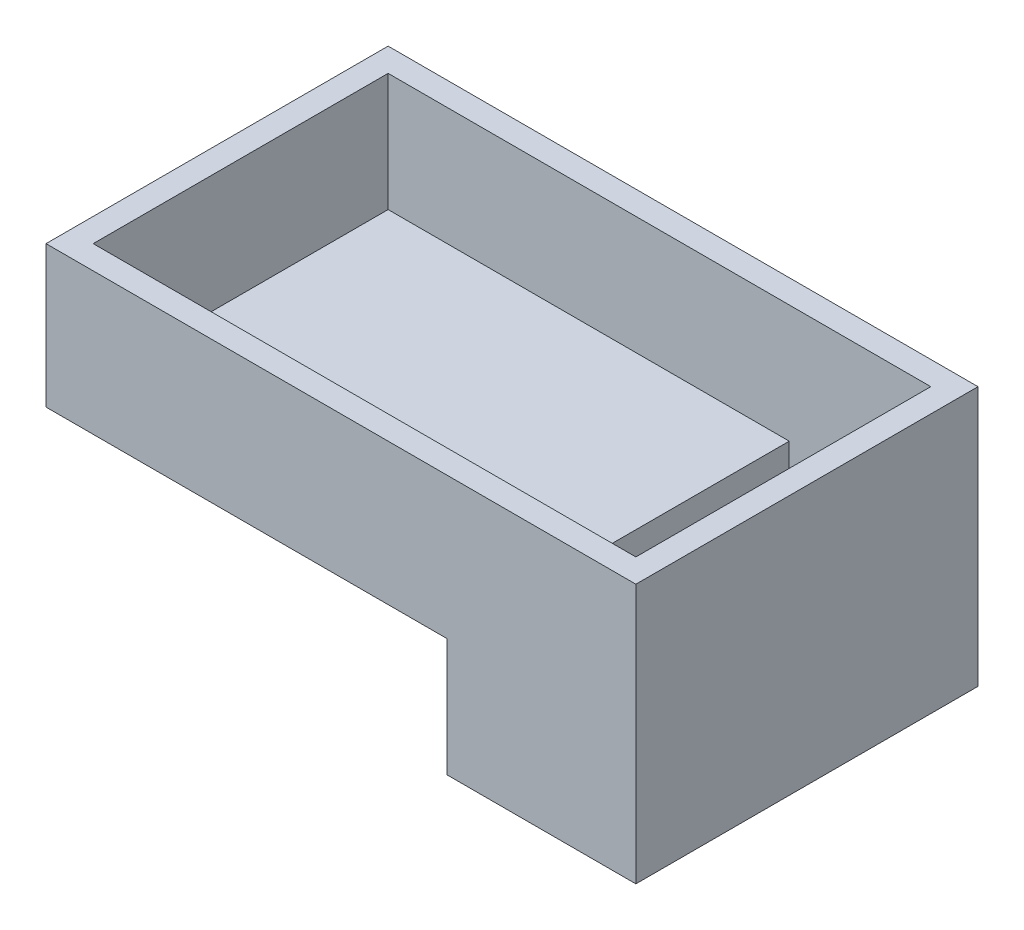
ISO-10303-21;
HEADER;
FILE_DESCRIPTION(('STEP AP214'),'2;1');
FILE_NAME('part.step','',(''),(''),'','','');
FILE_SCHEMA(('AUTOMOTIVE_DESIGN { 1 0 10303 214 1 1 1 1 }'));
ENDSEC;
DATA;
#1=APPLICATION_CONTEXT('core data for automotive mechanical design processes');
#2=APPLICATION_PROTOCOL_DEFINITION('international standard','automotive_design',2000,#1);
#3=PRODUCT_CONTEXT('',#1,'mechanical');
#4=PRODUCT('Part','Part','',(#3));
#5=PRODUCT_RELATED_PRODUCT_CATEGORY('part','',(#4));
#6=PRODUCT_DEFINITION_FORMATION('','',#4);
#7=PRODUCT_DEFINITION_CONTEXT('part definition',#1,'design');
#8=PRODUCT_DEFINITION('design','',#6,#7);
#9=PRODUCT_DEFINITION_SHAPE('','',#8);
#10=(LENGTH_UNIT() NAMED_UNIT(*) SI_UNIT(.MILLI.,.METRE.));
#11=(NAMED_UNIT(*) PLANE_ANGLE_UNIT() SI_UNIT($,.RADIAN.));
#12=(NAMED_UNIT(*) SI_UNIT($,.STERADIAN.) SOLID_ANGLE_UNIT());
#13=UNCERTAINTY_MEASURE_WITH_UNIT(LENGTH_MEASURE(1.E-05),#10,'distance_accuracy_value','');
#14=(GEOMETRIC_REPRESENTATION_CONTEXT(3) GLOBAL_UNCERTAINTY_ASSIGNED_CONTEXT((#13)) GLOBAL_UNIT_ASSIGNED_CONTEXT((#10,
#11,#12)) REPRESENTATION_CONTEXT('',''));
#15=CARTESIAN_POINT('',(0.,0.,0.));
#16=DIRECTION('',(0.,0.,1.));
#17=DIRECTION('',(1.,0.,0.));
#18=AXIS2_PLACEMENT_3D('',#15,#16,#17);
#19=CARTESIAN_POINT('',(0.,0.,1.));
#20=DIRECTION('',(0.,0.,1.));
#21=DIRECTION('',(1.,0.,0.));
#22=AXIS2_PLACEMENT_3D('',#19,#20,#21);
#23=PLANE('',#22);
#24=DIRECTION('',(-1.,0.,0.));
#25=VECTOR('',#24,1.);
#26=CARTESIAN_POINT('',(-28.921953221469,26.9609766107345,1.));
#27=LINE('',#26,#25);
#28=CARTESIAN_POINT('',(-29.921953221469,26.9609766107345,1.));
#29=VERTEX_POINT('',#28);
#30=CARTESIAN_POINT('',(-52.921953221469,26.9609766107345,1.));
#31=VERTEX_POINT('',#30);
#32=EDGE_CURVE('E240',#29,#31,#27,.T.);
#33=ORIENTED_EDGE('',*,*,#32,.T.);
#34=DIRECTION('',(0.,-1.,0.));
#35=VECTOR('',#34,1.);
#36=CARTESIAN_POINT('',(-52.921953221469,26.9609766107345,1.));
#37=LINE('',#36,#35);
#38=CARTESIAN_POINT('',(-52.921953221469,21.9609766107345,1.));
#39=VERTEX_POINT('',#38);
#40=EDGE_CURVE('E189',#31,#39,#37,.T.);
#41=ORIENTED_EDGE('',*,*,#40,.T.);
#42=DIRECTION('',(1.,0.,0.));
#43=VECTOR('',#42,1.);
#44=CARTESIAN_POINT('',(-52.921953221469,21.9609766107345,1.));
#45=LINE('',#44,#43);
#46=CARTESIAN_POINT('',(-35.921953221469,21.9609766107345,1.));
#47=VERTEX_POINT('',#46);
#48=EDGE_CURVE('E216',#39,#47,#45,.T.);
#49=ORIENTED_EDGE('',*,*,#48,.T.);
#50=DIRECTION('',(0.,-1.,0.));
#51=VECTOR('',#50,1.);
#52=CARTESIAN_POINT('',(-35.921953221469,21.9609766107345,1.));
#53=LINE('',#52,#51);
#54=CARTESIAN_POINT('',(-35.921953221469,16.9609766107345,1.));
#55=VERTEX_POINT('',#54);
#56=EDGE_CURVE('E212',#47,#55,#53,.T.);
#57=ORIENTED_EDGE('',*,*,#56,.T.);
#58=DIRECTION('',(1.,0.,0.));
#59=VECTOR('',#58,1.);
#60=CARTESIAN_POINT('',(-35.921953221469,16.9609766107345,1.));
#61=LINE('',#60,#59);
#62=CARTESIAN_POINT('',(-29.921953221469,16.9609766107345,1.));
#63=VERTEX_POINT('',#62);
#64=EDGE_CURVE('E208',#55,#63,#61,.T.);
#65=ORIENTED_EDGE('',*,*,#64,.T.);
#66=DIRECTION('',(0.,1.,0.));
#67=VECTOR('',#66,1.);
#68=CARTESIAN_POINT('',(-29.921953221469,16.9609766107345,1.));
#69=LINE('',#68,#67);
#70=EDGE_CURVE('E183',#63,#29,#69,.T.);
#71=ORIENTED_EDGE('',*,*,#70,.T.);
#72=EDGE_LOOP('',(#33,#41,#49,#57,#65,#71));
#73=FACE_BOUND('',#72,.T.);
#74=ADVANCED_FACE('F45',(#73),#23,.T.);
#75=CARTESIAN_POINT('',(-28.921953221469,15.9609766107345,1.));
#76=DIRECTION('',(-1.,0.,0.));
#77=DIRECTION('',(0.,0.,1.));
#78=AXIS2_PLACEMENT_3D('',#75,#76,#77);
#79=PLANE('',#78);
#80=DIRECTION('',(0.,1.,0.));
#81=VECTOR('',#80,1.);
#82=CARTESIAN_POINT('',(-28.921953221469,15.9609766107345,0.));
#83=LINE('',#82,#81);
#84=CARTESIAN_POINT('',(-28.921953221469,15.9609766107345,0.));
#85=VERTEX_POINT('',#84);
#86=CARTESIAN_POINT('',(-28.921953221469,26.9609766107345,0.));
#87=VERTEX_POINT('',#86);
#88=EDGE_CURVE('E239',#85,#87,#83,.T.);
#89=ORIENTED_EDGE('',*,*,#88,.T.);
#90=DIRECTION('',(0.,0.,-1.));
#91=VECTOR('',#90,1.);
#92=CARTESIAN_POINT('',(-28.921953221469,26.9609766107345,1.));
#93=LINE('',#92,#91);
#94=CARTESIAN_POINT('',(-28.921953221469,26.9609766107345,14.5));
#95=VERTEX_POINT('',#94);
#96=EDGE_CURVE('E11',#95,#87,#93,.T.);
#97=ORIENTED_EDGE('',*,*,#96,.F.);
#98=DIRECTION('',(0.,-1.,0.));
#99=VECTOR('',#98,1.);
#100=CARTESIAN_POINT('',(-28.921953221469,26.9609766107345,14.5));
#101=LINE('',#100,#99);
#102=CARTESIAN_POINT('',(-28.921953221469,15.9609766107345,14.5));
#103=VERTEX_POINT('',#102);
#104=EDGE_CURVE('E173',#95,#103,#101,.T.);
#105=ORIENTED_EDGE('',*,*,#104,.T.);
#106=DIRECTION('',(0.,0.,-1.));
#107=VECTOR('',#106,1.);
#108=CARTESIAN_POINT('',(-28.921953221469,15.9609766107345,1.));
#109=LINE('',#108,#107);
#110=EDGE_CURVE('E244',#103,#85,#109,.T.);
#111=ORIENTED_EDGE('',*,*,#110,.T.);
#112=EDGE_LOOP('',(#89,#97,#105,#111));
#113=FACE_BOUND('',#112,.T.);
#114=ADVANCED_FACE('F47',(#113),#79,.F.);
#115=CARTESIAN_POINT('',(-28.921953221469,26.9609766107345,1.));
#116=DIRECTION('',(0.,-1.,0.));
#117=DIRECTION('',(0.,0.,-1.));
#118=AXIS2_PLACEMENT_3D('',#115,#116,#117);
#119=PLANE('',#118);
#120=DIRECTION('',(0.,0.,-1.));
#121=VECTOR('',#120,1.);
#122=CARTESIAN_POINT('',(-29.921953221469,26.9609766107345,13.5));
#123=LINE('',#122,#121);
#124=CARTESIAN_POINT('',(-29.921953221469,26.9609766107345,13.5));
#125=VERTEX_POINT('',#124);
#126=EDGE_CURVE('E61',#125,#29,#123,.T.);
#127=ORIENTED_EDGE('',*,*,#126,.F.);
#128=DIRECTION('',(1.,0.,0.));
#129=VECTOR('',#128,1.);
#130=CARTESIAN_POINT('',(-53.921953221469,26.9609766107345,13.5));
#131=LINE('',#130,#129);
#132=CARTESIAN_POINT('',(-52.921953221469,26.9609766107345,13.5));
#133=VERTEX_POINT('',#132);
#134=EDGE_CURVE('E166',#133,#125,#131,.T.);
#135=ORIENTED_EDGE('',*,*,#134,.F.);
#136=DIRECTION('',(0.,0.,-1.));
#137=VECTOR('',#136,1.);
#138=CARTESIAN_POINT('',(-52.921953221469,26.9609766107345,13.5));
#139=LINE('',#138,#137);
#140=EDGE_CURVE('E205',#133,#31,#139,.T.);
#141=ORIENTED_EDGE('',*,*,#140,.T.);
#142=ORIENTED_EDGE('',*,*,#32,.F.);
#143=EDGE_LOOP('',(#127,#135,#141,#142));
#144=FACE_BOUND('',#143,.T.);
#145=DIRECTION('',(-1.,0.,0.));
#146=VECTOR('',#145,1.);
#147=CARTESIAN_POINT('',(-28.921953221469,26.9609766107345,0.));
#148=LINE('',#147,#146);
#149=CARTESIAN_POINT('',(-53.921953221469,26.9609766107345,0.));
#150=VERTEX_POINT('',#149);
#151=EDGE_CURVE('E248',#87,#150,#148,.T.);
#152=ORIENTED_EDGE('',*,*,#151,.T.);
#153=DIRECTION('',(0.,0.,-1.));
#154=VECTOR('',#153,1.);
#155=CARTESIAN_POINT('',(-53.921953221469,26.9609766107345,1.));
#156=LINE('',#155,#154);
#157=CARTESIAN_POINT('',(-53.921953221469,26.9609766107345,14.5));
#158=VERTEX_POINT('',#157);
#159=EDGE_CURVE('E54',#158,#150,#156,.T.);
#160=ORIENTED_EDGE('',*,*,#159,.F.);
#161=DIRECTION('',(1.,0.,0.));
#162=VECTOR('',#161,1.);
#163=CARTESIAN_POINT('',(-53.921953221469,26.9609766107345,14.5));
#164=LINE('',#163,#162);
#165=EDGE_CURVE('E160',#158,#95,#164,.T.);
#166=ORIENTED_EDGE('',*,*,#165,.T.);
#167=ORIENTED_EDGE('',*,*,#96,.T.);
#168=EDGE_LOOP('',(#152,#160,#166,#167));
#169=FACE_BOUND('',#168,.T.);
#170=ADVANCED_FACE('F277',(#144,#169),#119,.F.);
#171=CARTESIAN_POINT('',(-53.921953221469,26.9609766107345,1.));
#172=DIRECTION('',(1.,0.,0.));
#173=DIRECTION('',(0.,0.,-1.));
#174=AXIS2_PLACEMENT_3D('',#171,#172,#173);
#175=PLANE('',#174);
#176=DIRECTION('',(0.,-1.,0.));
#177=VECTOR('',#176,1.);
#178=CARTESIAN_POINT('',(-53.921953221469,26.9609766107345,0.));
#179=LINE('',#178,#177);
#180=CARTESIAN_POINT('',(-53.921953221469,20.9609766107345,0.));
#181=VERTEX_POINT('',#180);
#182=EDGE_CURVE('E144',#150,#181,#179,.T.);
#183=ORIENTED_EDGE('',*,*,#182,.T.);
#184=DIRECTION('',(0.,0.,-1.));
#185=VECTOR('',#184,1.);
#186=CARTESIAN_POINT('',(-53.921953221469,20.9609766107345,1.));
#187=LINE('',#186,#185);
#188=CARTESIAN_POINT('',(-53.921953221469,20.9609766107345,14.5));
#189=VERTEX_POINT('',#188);
#190=EDGE_CURVE('E138',#189,#181,#187,.T.);
#191=ORIENTED_EDGE('',*,*,#190,.F.);
#192=DIRECTION('',(0.,1.,0.));
#193=VECTOR('',#192,1.);
#194=CARTESIAN_POINT('',(-53.921953221469,20.9609766107345,14.5));
#195=LINE('',#194,#193);
#196=EDGE_CURVE('E142',#189,#158,#195,.T.);
#197=ORIENTED_EDGE('',*,*,#196,.T.);
#198=ORIENTED_EDGE('',*,*,#159,.T.);
#199=EDGE_LOOP('',(#183,#191,#197,#198));
#200=FACE_BOUND('',#199,.T.);
#201=ADVANCED_FACE('F140',(#200),#175,.F.);
#202=CARTESIAN_POINT('',(-53.921953221469,20.9609766107345,1.));
#203=DIRECTION('',(0.,1.,0.));
#204=DIRECTION('',(0.,0.,1.));
#205=AXIS2_PLACEMENT_3D('',#202,#203,#204);
#206=PLANE('',#205);
#207=DIRECTION('',(1.,0.,0.));
#208=VECTOR('',#207,1.);
#209=CARTESIAN_POINT('',(-53.921953221469,20.9609766107345,0.));
#210=LINE('',#209,#208);
#211=CARTESIAN_POINT('',(-36.921953221469,20.9609766107345,0.));
#212=VERTEX_POINT('',#211);
#213=EDGE_CURVE('E253',#181,#212,#210,.T.);
#214=ORIENTED_EDGE('',*,*,#213,.T.);
#215=DIRECTION('',(0.,0.,-1.));
#216=VECTOR('',#215,1.);
#217=CARTESIAN_POINT('',(-36.921953221469,20.9609766107345,1.));
#218=LINE('',#217,#216);
#219=CARTESIAN_POINT('',(-36.921953221469,20.9609766107345,14.5));
#220=VERTEX_POINT('',#219);
#221=EDGE_CURVE('E149',#220,#212,#218,.T.);
#222=ORIENTED_EDGE('',*,*,#221,.F.);
#223=DIRECTION('',(-1.,0.,0.));
#224=VECTOR('',#223,1.);
#225=CARTESIAN_POINT('',(-36.921953221469,20.9609766107345,14.5));
#226=LINE('',#225,#224);
#227=EDGE_CURVE('E156',#220,#189,#226,.T.);
#228=ORIENTED_EDGE('',*,*,#227,.T.);
#229=ORIENTED_EDGE('',*,*,#190,.T.);
#230=EDGE_LOOP('',(#214,#222,#228,#229));
#231=FACE_BOUND('',#230,.T.);
#232=ADVANCED_FACE('F163',(#231),#206,.F.);
#233=CARTESIAN_POINT('',(-36.921953221469,20.9609766107345,1.));
#234=DIRECTION('',(1.,0.,0.));
#235=DIRECTION('',(0.,0.,-1.));
#236=AXIS2_PLACEMENT_3D('',#233,#234,#235);
#237=PLANE('',#236);
#238=DIRECTION('',(0.,-1.,0.));
#239=VECTOR('',#238,1.);
#240=CARTESIAN_POINT('',(-36.921953221469,20.9609766107345,0.));
#241=LINE('',#240,#239);
#242=CARTESIAN_POINT('',(-36.921953221469,15.9609766107345,0.));
#243=VERTEX_POINT('',#242);
#244=EDGE_CURVE('E256',#212,#243,#241,.T.);
#245=ORIENTED_EDGE('',*,*,#244,.T.);
#246=DIRECTION('',(0.,0.,-1.));
#247=VECTOR('',#246,1.);
#248=CARTESIAN_POINT('',(-36.921953221469,15.9609766107345,1.));
#249=LINE('',#248,#247);
#250=CARTESIAN_POINT('',(-36.921953221469,15.9609766107345,14.5));
#251=VERTEX_POINT('',#250);
#252=EDGE_CURVE('E263',#251,#243,#249,.T.);
#253=ORIENTED_EDGE('',*,*,#252,.F.);
#254=DIRECTION('',(0.,1.,0.));
#255=VECTOR('',#254,1.);
#256=CARTESIAN_POINT('',(-36.921953221469,15.9609766107345,14.5));
#257=LINE('',#256,#255);
#258=EDGE_CURVE('E181',#251,#220,#257,.T.);
#259=ORIENTED_EDGE('',*,*,#258,.T.);
#260=ORIENTED_EDGE('',*,*,#221,.T.);
#261=EDGE_LOOP('',(#245,#253,#259,#260));
#262=FACE_BOUND('',#261,.T.);
#263=ADVANCED_FACE('F274',(#262),#237,.F.);
#264=CARTESIAN_POINT('',(-36.921953221469,15.9609766107345,1.));
#265=DIRECTION('',(0.,1.,0.));
#266=DIRECTION('',(0.,0.,1.));
#267=AXIS2_PLACEMENT_3D('',#264,#265,#266);
#268=PLANE('',#267);
#269=DIRECTION('',(1.,0.,0.));
#270=VECTOR('',#269,1.);
#271=CARTESIAN_POINT('',(-36.921953221469,15.9609766107345,0.));
#272=LINE('',#271,#270);
#273=EDGE_CURVE('E69',#243,#85,#272,.T.);
#274=ORIENTED_EDGE('',*,*,#273,.T.);
#275=ORIENTED_EDGE('',*,*,#110,.F.);
#276=DIRECTION('',(-1.,0.,0.));
#277=VECTOR('',#276,1.);
#278=CARTESIAN_POINT('',(-28.921953221469,15.9609766107345,14.5));
#279=LINE('',#278,#277);
#280=EDGE_CURVE('E177',#103,#251,#279,.T.);
#281=ORIENTED_EDGE('',*,*,#280,.T.);
#282=ORIENTED_EDGE('',*,*,#252,.T.);
#283=EDGE_LOOP('',(#274,#275,#281,#282));
#284=FACE_BOUND('',#283,.T.);
#285=ADVANCED_FACE('F296',(#284),#268,.F.);
#286=CARTESIAN_POINT('',(0.,0.,0.));
#287=DIRECTION('',(0.,0.,1.));
#288=DIRECTION('',(1.,0.,0.));
#289=AXIS2_PLACEMENT_3D('',#286,#287,#288);
#290=PLANE('',#289);
#291=ORIENTED_EDGE('',*,*,#88,.F.);
#292=ORIENTED_EDGE('',*,*,#273,.F.);
#293=ORIENTED_EDGE('',*,*,#244,.F.);
#294=ORIENTED_EDGE('',*,*,#213,.F.);
#295=ORIENTED_EDGE('',*,*,#182,.F.);
#296=ORIENTED_EDGE('',*,*,#151,.F.);
#297=EDGE_LOOP('',(#291,#292,#293,#294,#295,#296));
#298=FACE_BOUND('',#297,.T.);
#299=ADVANCED_FACE('F271',(#298),#290,.F.);
#300=CARTESIAN_POINT('',(-29.921953221469,16.9609766107345,13.5));
#301=DIRECTION('',(-1.,0.,0.));
#302=DIRECTION('',(0.,0.,1.));
#303=AXIS2_PLACEMENT_3D('',#300,#301,#302);
#304=PLANE('',#303);
#305=ORIENTED_EDGE('',*,*,#70,.F.);
#306=DIRECTION('',(0.,0.,-1.));
#307=VECTOR('',#306,1.);
#308=CARTESIAN_POINT('',(-29.921953221469,16.9609766107345,13.5));
#309=LINE('',#308,#307);
#310=CARTESIAN_POINT('',(-29.921953221469,16.9609766107345,13.5));
#311=VERTEX_POINT('',#310);
#312=EDGE_CURVE('E234',#311,#63,#309,.T.);
#313=ORIENTED_EDGE('',*,*,#312,.F.);
#314=DIRECTION('',(0.,1.,0.));
#315=VECTOR('',#314,1.);
#316=CARTESIAN_POINT('',(-29.921953221469,16.9609766107345,13.5));
#317=LINE('',#316,#315);
#318=EDGE_CURVE('E185',#311,#125,#317,.T.);
#319=ORIENTED_EDGE('',*,*,#318,.T.);
#320=ORIENTED_EDGE('',*,*,#126,.T.);
#321=EDGE_LOOP('',(#305,#313,#319,#320));
#322=FACE_BOUND('',#321,.T.);
#323=ADVANCED_FACE('F293',(#322),#304,.T.);
#324=CARTESIAN_POINT('',(-35.921953221469,16.9609766107345,13.5));
#325=DIRECTION('',(0.,1.,0.));
#326=DIRECTION('',(0.,0.,1.));
#327=AXIS2_PLACEMENT_3D('',#324,#325,#326);
#328=PLANE('',#327);
#329=ORIENTED_EDGE('',*,*,#64,.F.);
#330=DIRECTION('',(0.,0.,-1.));
#331=VECTOR('',#330,1.);
#332=CARTESIAN_POINT('',(-35.921953221469,16.9609766107345,13.5));
#333=LINE('',#332,#331);
#334=CARTESIAN_POINT('',(-35.921953221469,16.9609766107345,13.5));
#335=VERTEX_POINT('',#334);
#336=EDGE_CURVE('E231',#335,#55,#333,.T.);
#337=ORIENTED_EDGE('',*,*,#336,.F.);
#338=DIRECTION('',(1.,0.,0.));
#339=VECTOR('',#338,1.);
#340=CARTESIAN_POINT('',(-35.921953221469,16.9609766107345,13.5));
#341=LINE('',#340,#339);
#342=EDGE_CURVE('E188',#335,#311,#341,.T.);
#343=ORIENTED_EDGE('',*,*,#342,.T.);
#344=ORIENTED_EDGE('',*,*,#312,.T.);
#345=EDGE_LOOP('',(#329,#337,#343,#344));
#346=FACE_BOUND('',#345,.T.);
#347=ADVANCED_FACE('F324',(#346),#328,.T.);
#348=CARTESIAN_POINT('',(-35.921953221469,21.9609766107345,13.5));
#349=DIRECTION('',(1.,0.,0.));
#350=DIRECTION('',(0.,0.,-1.));
#351=AXIS2_PLACEMENT_3D('',#348,#349,#350);
#352=PLANE('',#351);
#353=ORIENTED_EDGE('',*,*,#56,.F.);
#354=DIRECTION('',(0.,0.,-1.));
#355=VECTOR('',#354,1.);
#356=CARTESIAN_POINT('',(-35.921953221469,21.9609766107345,13.5));
#357=LINE('',#356,#355);
#358=CARTESIAN_POINT('',(-35.921953221469,21.9609766107345,13.5));
#359=VERTEX_POINT('',#358);
#360=EDGE_CURVE('E228',#359,#47,#357,.T.);
#361=ORIENTED_EDGE('',*,*,#360,.F.);
#362=DIRECTION('',(0.,-1.,0.));
#363=VECTOR('',#362,1.);
#364=CARTESIAN_POINT('',(-35.921953221469,21.9609766107345,13.5));
#365=LINE('',#364,#363);
#366=EDGE_CURVE('E193',#359,#335,#365,.T.);
#367=ORIENTED_EDGE('',*,*,#366,.T.);
#368=ORIENTED_EDGE('',*,*,#336,.T.);
#369=EDGE_LOOP('',(#353,#361,#367,#368));
#370=FACE_BOUND('',#369,.T.);
#371=ADVANCED_FACE('F331',(#370),#352,.T.);
#372=CARTESIAN_POINT('',(-52.921953221469,21.9609766107345,13.5));
#373=DIRECTION('',(0.,1.,0.));
#374=DIRECTION('',(0.,0.,1.));
#375=AXIS2_PLACEMENT_3D('',#372,#373,#374);
#376=PLANE('',#375);
#377=ORIENTED_EDGE('',*,*,#48,.F.);
#378=DIRECTION('',(0.,0.,-1.));
#379=VECTOR('',#378,1.);
#380=CARTESIAN_POINT('',(-52.921953221469,21.9609766107345,13.5));
#381=LINE('',#380,#379);
#382=CARTESIAN_POINT('',(-52.921953221469,21.9609766107345,13.5));
#383=VERTEX_POINT('',#382);
#384=EDGE_CURVE('E225',#383,#39,#381,.T.);
#385=ORIENTED_EDGE('',*,*,#384,.F.);
#386=DIRECTION('',(1.,0.,0.));
#387=VECTOR('',#386,1.);
#388=CARTESIAN_POINT('',(-52.921953221469,21.9609766107345,13.5));
#389=LINE('',#388,#387);
#390=EDGE_CURVE('E197',#383,#359,#389,.T.);
#391=ORIENTED_EDGE('',*,*,#390,.T.);
#392=ORIENTED_EDGE('',*,*,#360,.T.);
#393=EDGE_LOOP('',(#377,#385,#391,#392));
#394=FACE_BOUND('',#393,.T.);
#395=ADVANCED_FACE('F339',(#394),#376,.T.);
#396=CARTESIAN_POINT('',(-52.921953221469,26.9609766107345,13.5));
#397=DIRECTION('',(1.,0.,0.));
#398=DIRECTION('',(0.,0.,-1.));
#399=AXIS2_PLACEMENT_3D('',#396,#397,#398);
#400=PLANE('',#399);
#401=ORIENTED_EDGE('',*,*,#40,.F.);
#402=ORIENTED_EDGE('',*,*,#140,.F.);
#403=DIRECTION('',(0.,-1.,0.));
#404=VECTOR('',#403,1.);
#405=CARTESIAN_POINT('',(-52.921953221469,26.9609766107345,13.5));
#406=LINE('',#405,#404);
#407=EDGE_CURVE('E201',#133,#383,#406,.T.);
#408=ORIENTED_EDGE('',*,*,#407,.T.);
#409=ORIENTED_EDGE('',*,*,#384,.T.);
#410=EDGE_LOOP('',(#401,#402,#408,#409));
#411=FACE_BOUND('',#410,.T.);
#412=ADVANCED_FACE('F348',(#411),#400,.T.);
#413=CARTESIAN_POINT('',(0.,0.,13.5));
#414=DIRECTION('',(0.,0.,-1.));
#415=DIRECTION('',(-1.,0.,0.));
#416=AXIS2_PLACEMENT_3D('',#413,#414,#415);
#417=PLANE('',#416);
#418=ORIENTED_EDGE('',*,*,#318,.F.);
#419=ORIENTED_EDGE('',*,*,#342,.F.);
#420=ORIENTED_EDGE('',*,*,#366,.F.);
#421=ORIENTED_EDGE('',*,*,#390,.F.);
#422=ORIENTED_EDGE('',*,*,#407,.F.);
#423=ORIENTED_EDGE('',*,*,#134,.T.);
#424=EDGE_LOOP('',(#418,#419,#420,#421,#422,#423));
#425=FACE_BOUND('',#424,.T.);
#426=ADVANCED_FACE('F357',(#425),#417,.T.);
#427=CARTESIAN_POINT('',(0.,0.,14.5));
#428=DIRECTION('',(0.,0.,-1.));
#429=DIRECTION('',(-1.,0.,0.));
#430=AXIS2_PLACEMENT_3D('',#427,#428,#429);
#431=PLANE('',#430);
#432=ORIENTED_EDGE('',*,*,#227,.F.);
#433=ORIENTED_EDGE('',*,*,#258,.F.);
#434=ORIENTED_EDGE('',*,*,#280,.F.);
#435=ORIENTED_EDGE('',*,*,#104,.F.);
#436=ORIENTED_EDGE('',*,*,#165,.F.);
#437=ORIENTED_EDGE('',*,*,#196,.F.);
#438=EDGE_LOOP('',(#432,#433,#434,#435,#436,#437));
#439=FACE_BOUND('',#438,.T.);
#440=ADVANCED_FACE('F154',(#439),#431,.F.);
#441=CLOSED_SHELL('',(#74,#114,#170,#201,#232,#263,#285,#299,#323,#347,#371,#395,#412,#426,#440));
#442=MANIFOLD_SOLID_BREP('B2',#441);
#443=ADVANCED_BREP_SHAPE_REPRESENTATION('',(#18,#442),#14);
#444=SHAPE_DEFINITION_REPRESENTATION(#9,#443);
ENDSEC;
END-ISO-10303-21;
